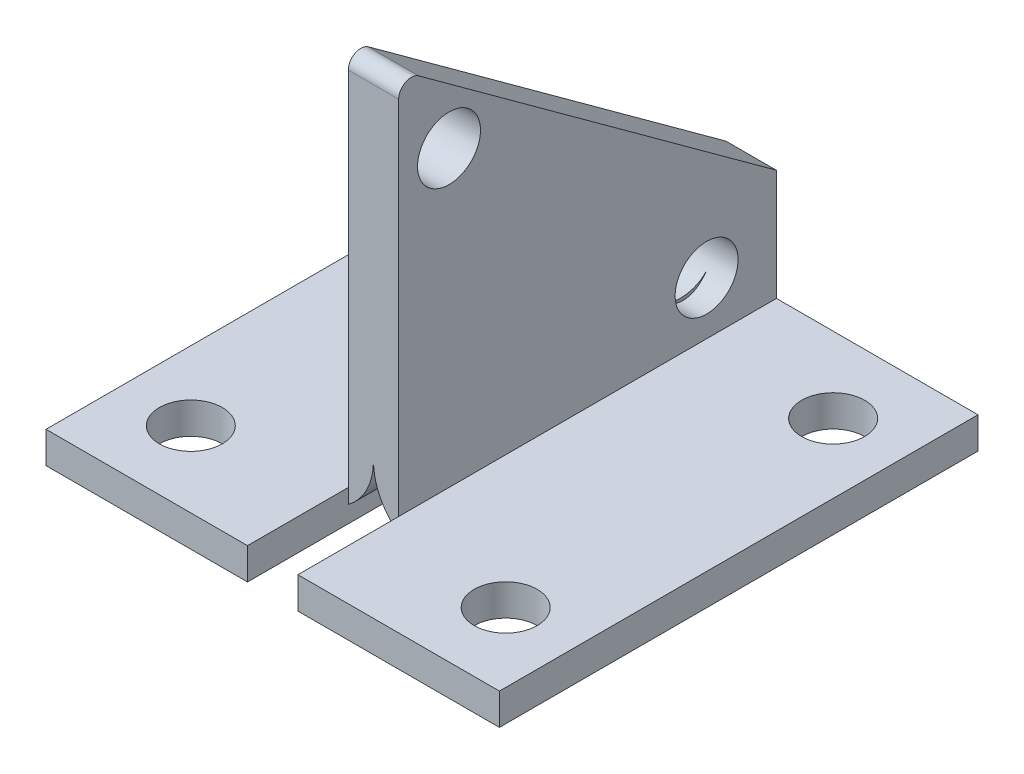
ISO-10303-21;
HEADER;
FILE_DESCRIPTION(('STEP AP214'),'2;1');
FILE_NAME('part.step','',(''),(''),'','','');
FILE_SCHEMA(('AUTOMOTIVE_DESIGN { 1 0 10303 214 1 1 1 1 }'));
ENDSEC;
DATA;
#1=APPLICATION_CONTEXT('core data for automotive mechanical design processes');
#2=APPLICATION_PROTOCOL_DEFINITION('international standard','automotive_design',2000,#1);
#3=PRODUCT_CONTEXT('',#1,'mechanical');
#4=PRODUCT('Part','Part','',(#3));
#5=PRODUCT_RELATED_PRODUCT_CATEGORY('part','',(#4));
#6=PRODUCT_DEFINITION_FORMATION('','',#4);
#7=PRODUCT_DEFINITION_CONTEXT('part definition',#1,'design');
#8=PRODUCT_DEFINITION('design','',#6,#7);
#9=PRODUCT_DEFINITION_SHAPE('','',#8);
#10=(LENGTH_UNIT() NAMED_UNIT(*) SI_UNIT(.MILLI.,.METRE.));
#11=(NAMED_UNIT(*) PLANE_ANGLE_UNIT() SI_UNIT($,.RADIAN.));
#12=(NAMED_UNIT(*) SI_UNIT($,.STERADIAN.) SOLID_ANGLE_UNIT());
#13=UNCERTAINTY_MEASURE_WITH_UNIT(LENGTH_MEASURE(1.E-05),#10,'distance_accuracy_value','');
#14=(GEOMETRIC_REPRESENTATION_CONTEXT(3) GLOBAL_UNCERTAINTY_ASSIGNED_CONTEXT((#13)) GLOBAL_UNIT_ASSIGNED_CONTEXT((#10,
#11,#12)) REPRESENTATION_CONTEXT('',''));
#15=CARTESIAN_POINT('',(0.,0.,0.));
#16=DIRECTION('',(0.,0.,1.));
#17=DIRECTION('',(1.,0.,0.));
#18=AXIS2_PLACEMENT_3D('',#15,#16,#17);
#19=CARTESIAN_POINT('',(2.,0.,0.));
#20=DIRECTION('',(1.,0.,0.));
#21=DIRECTION('',(0.,0.,-1.));
#22=AXIS2_PLACEMENT_3D('',#19,#20,#21);
#23=PLANE('',#22);
#24=DIRECTION('',(0.,0.588747506472137,0.808317000701359));
#25=VECTOR('',#24,1.);
#26=CARTESIAN_POINT('',(2.,12.5558053302707,60.9514449315034));
#27=LINE('',#26,#25);
#28=CARTESIAN_POINT('',(2.,-9.28274427099266,30.9683524864291));
#29=VERTEX_POINT('',#28);
#30=CARTESIAN_POINT('',(2.,11.3986217846597,59.3626974250312));
#31=VERTEX_POINT('',#30);
#32=EDGE_CURVE('E385',#29,#31,#27,.T.);
#33=ORIENTED_EDGE('',*,*,#32,.T.);
#34=CARTESIAN_POINT('',(2.,10.5903047839583,59.9514449315034));
#35=DIRECTION('',(1.,0.,0.));
#36=DIRECTION('',(0.,0.,-1.));
#37=AXIS2_PLACEMENT_3D('',#34,#35,#36);
#38=CIRCLE('',#37,1.);
#39=CARTESIAN_POINT('',(2.,10.5903047839583,60.9514449315034));
#40=VERTEX_POINT('',#39);
#41=EDGE_CURVE('E11',#31,#40,#38,.T.);
#42=ORIENTED_EDGE('',*,*,#41,.T.);
#43=DIRECTION('',(0.,-1.,0.));
#44=VECTOR('',#43,1.);
#45=CARTESIAN_POINT('',(2.,-19.2827442709927,60.9514449315034));
#46=LINE('',#45,#44);
#47=CARTESIAN_POINT('',(2.,-18.1092918345207,60.9514449315034));
#48=VERTEX_POINT('',#47);
#49=EDGE_CURVE('E297',#40,#48,#46,.T.);
#50=ORIENTED_EDGE('',*,*,#49,.T.);
#51=DIRECTION('',(0.,0.,1.));
#52=VECTOR('',#51,1.);
#53=CARTESIAN_POINT('',(2.,-18.1092918345207,68.9514449315034));
#54=LINE('',#53,#52);
#55=CARTESIAN_POINT('',(2.,-18.1092918345207,30.9534289526556));
#56=VERTEX_POINT('',#55);
#57=EDGE_CURVE('E395',#56,#48,#54,.T.);
#58=ORIENTED_EDGE('',*,*,#57,.F.);
#59=DIRECTION('',(0.,0.999998570675997,0.00169075307593077));
#60=VECTOR('',#59,1.);
#61=CARTESIAN_POINT('',(2.,-19.2827442709927,30.9514449315034));
#62=LINE('',#61,#60);
#63=EDGE_CURVE('E304',#56,#29,#62,.T.);
#64=ORIENTED_EDGE('',*,*,#63,.T.);
#65=EDGE_LOOP('',(#33,#42,#50,#58,#64));
#66=FACE_BOUND('',#65,.T.);
#67=CARTESIAN_POINT('',(2.,-13.9127450646303,36.5012704341606));
#68=DIRECTION('',(1.,0.,0.));
#69=DIRECTION('',(0.,0.,1.));
#70=AXIS2_PLACEMENT_3D('',#67,#68,#69);
#71=CIRCLE('',#70,2.5);
#72=CARTESIAN_POINT('',(2.,-13.9127450646303,39.0012704341606));
#73=VERTEX_POINT('',#72);
#74=EDGE_CURVE('E375',#73,#73,#71,.T.);
#75=ORIENTED_EDGE('',*,*,#74,.F.);
#76=EDGE_LOOP('',(#75));
#77=FACE_BOUND('',#76,.T.);
#78=CARTESIAN_POINT('',(2.,5.21290167027072,56.9514449315034));
#79=DIRECTION('',(1.,0.,0.));
#80=DIRECTION('',(0.,0.,1.));
#81=AXIS2_PLACEMENT_3D('',#78,#79,#80);
#82=CIRCLE('',#81,2.5);
#83=CARTESIAN_POINT('',(2.,5.21290167027072,59.4514449315034));
#84=VERTEX_POINT('',#83);
#85=EDGE_CURVE('E372',#84,#84,#82,.T.);
#86=ORIENTED_EDGE('',*,*,#85,.F.);
#87=EDGE_LOOP('',(#86));
#88=FACE_BOUND('',#87,.T.);
#89=ADVANCED_FACE('F33',(#66,#77,#88),#23,.T.);
#90=CARTESIAN_POINT('',(2.,-19.2827442709927,30.9514449315034));
#91=DIRECTION('',(0.,-0.00169075307593077,0.999998570675997));
#92=DIRECTION('',(0.,-0.999998570675997,-0.00169075307593077));
#93=AXIS2_PLACEMENT_3D('',#90,#91,#92);
#94=PLANE('',#93);
#95=DIRECTION('',(-1.,0.,0.));
#96=VECTOR('',#95,1.);
#97=CARTESIAN_POINT('',(18.,-19.2827442709927,30.9514449315034));
#98=LINE('',#97,#96);
#99=CARTESIAN_POINT('',(18.,-19.2827442709927,30.9514449315034));
#100=VERTEX_POINT('',#99);
#101=CARTESIAN_POINT('',(2.,-19.2827442709927,30.9514449315034));
#102=VERTEX_POINT('',#101);
#103=EDGE_CURVE('E405',#100,#102,#98,.T.);
#104=ORIENTED_EDGE('',*,*,#103,.T.);
#105=CARTESIAN_POINT('',(5.,-15.2827442709927,30.9582079534737));
#106=DIRECTION('',(0.,-0.00169075307593077,0.999998570675997));
#107=DIRECTION('',(0.,0.999998570675997,0.00169075307593077));
#108=AXIS2_PLACEMENT_3D('',#105,#106,#107);
#109=ELLIPSE('',#108,5.00000714663023,5.);
#110=CARTESIAN_POINT('',(0.,-15.2827442709927,30.9582079534737));
#111=VERTEX_POINT('',#110);
#112=EDGE_CURVE('E306',#102,#111,#109,.F.);
#113=ORIENTED_EDGE('',*,*,#112,.T.);
#114=CARTESIAN_POINT('',(-5.,-15.2827442709927,30.9582079534737));
#115=DIRECTION('',(0.,0.00169075307593077,-0.999998570675997));
#116=DIRECTION('',(0.,0.999998570675997,0.00169075307593077));
#117=AXIS2_PLACEMENT_3D('',#114,#115,#116);
#118=ELLIPSE('',#117,5.00000714663023,5.);
#119=CARTESIAN_POINT('',(-2.,-19.2827442709927,30.9514449315034));
#120=VERTEX_POINT('',#119);
#121=EDGE_CURVE('E225',#120,#111,#118,.F.);
#122=ORIENTED_EDGE('',*,*,#121,.F.);
#123=DIRECTION('',(1.,0.,0.));
#124=VECTOR('',#123,1.);
#125=CARTESIAN_POINT('',(-18.,-19.2827442709927,30.9514449315034));
#126=LINE('',#125,#124);
#127=CARTESIAN_POINT('',(-18.,-19.2827442709927,30.9514449315034));
#128=VERTEX_POINT('',#127);
#129=EDGE_CURVE('E180',#128,#120,#126,.T.);
#130=ORIENTED_EDGE('',*,*,#129,.F.);
#131=DIRECTION('',(0.,0.999998570675997,0.00169075307593095));
#132=VECTOR('',#131,1.);
#133=CARTESIAN_POINT('',(-18.,-18.1092918345207,30.9534289526556));
#134=LINE('',#133,#132);
#135=CARTESIAN_POINT('',(-18.,-18.1092918345207,30.9534289526556));
#136=VERTEX_POINT('',#135);
#137=EDGE_CURVE('E156',#128,#136,#134,.T.);
#138=ORIENTED_EDGE('',*,*,#137,.T.);
#139=DIRECTION('',(1.,0.,0.));
#140=VECTOR('',#139,1.);
#141=CARTESIAN_POINT('',(-18.,-18.1092918345207,30.9534289526556));
#142=LINE('',#141,#140);
#143=CARTESIAN_POINT('',(-2.,-18.1092918345207,30.9534289526556));
#144=VERTEX_POINT('',#143);
#145=EDGE_CURVE('E165',#136,#144,#142,.T.);
#146=ORIENTED_EDGE('',*,*,#145,.T.);
#147=DIRECTION('',(0.,0.999998570675997,0.00169075307593077));
#148=VECTOR('',#147,1.);
#149=CARTESIAN_POINT('',(-2.,-19.2827442709927,30.9514449315034));
#150=LINE('',#149,#148);
#151=CARTESIAN_POINT('',(-2.,-9.28274427099266,30.9683524864291));
#152=VERTEX_POINT('',#151);
#153=EDGE_CURVE('E216',#144,#152,#150,.T.);
#154=ORIENTED_EDGE('',*,*,#153,.T.);
#155=DIRECTION('',(-1.,0.,0.));
#156=VECTOR('',#155,1.);
#157=CARTESIAN_POINT('',(2.,-9.28274427099266,30.9683524864291));
#158=LINE('',#157,#156);
#159=EDGE_CURVE('E302',#29,#152,#158,.T.);
#160=ORIENTED_EDGE('',*,*,#159,.F.);
#161=ORIENTED_EDGE('',*,*,#63,.F.);
#162=DIRECTION('',(-1.,0.,0.));
#163=VECTOR('',#162,1.);
#164=CARTESIAN_POINT('',(18.,-18.1092918345207,30.9534289526556));
#165=LINE('',#164,#163);
#166=CARTESIAN_POINT('',(18.,-18.1092918345207,30.9534289526556));
#167=VERTEX_POINT('',#166);
#168=EDGE_CURVE('E369',#167,#56,#165,.T.);
#169=ORIENTED_EDGE('',*,*,#168,.F.);
#170=DIRECTION('',(0.,0.999998570675997,0.00169075307593095));
#171=VECTOR('',#170,1.);
#172=CARTESIAN_POINT('',(18.,-18.1092918345207,30.9534289526556));
#173=LINE('',#172,#171);
#174=EDGE_CURVE('E362',#100,#167,#173,.T.);
#175=ORIENTED_EDGE('',*,*,#174,.F.);
#176=EDGE_LOOP('',(#104,#113,#122,#130,#138,#146,#154,#160,#161,#169,#175));
#177=FACE_BOUND('',#176,.T.);
#178=ADVANCED_FACE('F177',(#177),#94,.F.);
#179=CARTESIAN_POINT('',(2.,12.5558053302707,60.9514449315034));
#180=DIRECTION('',(0.,-0.808317000701359,0.588747506472137));
#181=DIRECTION('',(0.,-0.588747506472137,-0.808317000701359));
#182=AXIS2_PLACEMENT_3D('',#179,#180,#181);
#183=PLANE('',#182);
#184=DIRECTION('',(0.,0.588747506472137,0.808317000701359));
#185=VECTOR('',#184,1.);
#186=CARTESIAN_POINT('',(-2.,12.5558053302707,60.9514449315034));
#187=LINE('',#186,#185);
#188=CARTESIAN_POINT('',(-2.,11.3986217846597,59.3626974250312));
#189=VERTEX_POINT('',#188);
#190=EDGE_CURVE('E218',#152,#189,#187,.T.);
#191=ORIENTED_EDGE('',*,*,#190,.T.);
#192=DIRECTION('',(-1.,0.,0.));
#193=VECTOR('',#192,1.);
#194=CARTESIAN_POINT('',(2.,11.3986217846597,59.3626974250312));
#195=LINE('',#194,#193);
#196=EDGE_CURVE('E41',#189,#31,#195,.F.);
#197=ORIENTED_EDGE('',*,*,#196,.T.);
#198=ORIENTED_EDGE('',*,*,#32,.F.);
#199=ORIENTED_EDGE('',*,*,#159,.T.);
#200=EDGE_LOOP('',(#191,#197,#198,#199));
#201=FACE_BOUND('',#200,.T.);
#202=ADVANCED_FACE('F264',(#201),#183,.F.);
#203=CARTESIAN_POINT('',(2.,-19.2827442709927,60.9514449315034));
#204=DIRECTION('',(0.,0.,-1.));
#205=DIRECTION('',(-1.,0.,0.));
#206=AXIS2_PLACEMENT_3D('',#203,#204,#205);
#207=PLANE('',#206);
#208=ORIENTED_EDGE('',*,*,#49,.F.);
#209=DIRECTION('',(-1.,0.,0.));
#210=VECTOR('',#209,1.);
#211=CARTESIAN_POINT('',(2.,10.5903047839583,60.9514449315034));
#212=LINE('',#211,#210);
#213=CARTESIAN_POINT('',(-2.,10.5903047839583,60.9514449315034));
#214=VERTEX_POINT('',#213);
#215=EDGE_CURVE('E290',#40,#214,#212,.T.);
#216=ORIENTED_EDGE('',*,*,#215,.T.);
#217=DIRECTION('',(0.,-1.,0.));
#218=VECTOR('',#217,1.);
#219=CARTESIAN_POINT('',(-2.,-19.2827442709927,60.9514449315034));
#220=LINE('',#219,#218);
#221=CARTESIAN_POINT('',(-2.,-18.1092918345207,60.9514449315034));
#222=VERTEX_POINT('',#221);
#223=EDGE_CURVE('E221',#214,#222,#220,.T.);
#224=ORIENTED_EDGE('',*,*,#223,.T.);
#225=CARTESIAN_POINT('',(-2.,-19.2827442709927,60.9514449315034));
#226=VERTEX_POINT('',#225);
#227=EDGE_CURVE('E220',#222,#226,#220,.T.);
#228=ORIENTED_EDGE('',*,*,#227,.T.);
#229=CARTESIAN_POINT('',(-5.,-15.2827442709927,60.9514449315034));
#230=DIRECTION('',(0.,0.,1.));
#231=DIRECTION('',(1.,0.,0.));
#232=AXIS2_PLACEMENT_3D('',#229,#230,#231);
#233=CIRCLE('',#232,5.);
#234=CARTESIAN_POINT('',(0.,-15.2827442709927,60.9514449315034));
#235=VERTEX_POINT('',#234);
#236=EDGE_CURVE('E237',#235,#226,#233,.F.);
#237=ORIENTED_EDGE('',*,*,#236,.F.);
#238=CARTESIAN_POINT('',(5.,-15.2827442709927,60.9514449315034));
#239=DIRECTION('',(0.,0.,-1.));
#240=DIRECTION('',(-1.,0.,0.));
#241=AXIS2_PLACEMENT_3D('',#238,#239,#240);
#242=CIRCLE('',#241,5.);
#243=CARTESIAN_POINT('',(2.,-19.2827442709927,60.9514449315034));
#244=VERTEX_POINT('',#243);
#245=EDGE_CURVE('E286',#235,#244,#242,.F.);
#246=ORIENTED_EDGE('',*,*,#245,.T.);
#247=EDGE_CURVE('E386',#48,#244,#46,.T.);
#248=ORIENTED_EDGE('',*,*,#247,.F.);
#249=EDGE_LOOP('',(#208,#216,#224,#228,#237,#246,#248));
#250=FACE_BOUND('',#249,.T.);
#251=ADVANCED_FACE('F272',(#250),#207,.F.);
#252=CARTESIAN_POINT('',(2.,-13.9127450646303,36.5012704341606));
#253=DIRECTION('',(-1.,0.,0.));
#254=DIRECTION('',(0.,0.,1.));
#255=AXIS2_PLACEMENT_3D('',#252,#253,#254);
#256=CYLINDRICAL_SURFACE('',#255,2.5);
#257=ORIENTED_EDGE('',*,*,#74,.T.);
#258=EDGE_LOOP('',(#257));
#259=FACE_BOUND('',#258,.T.);
#260=CARTESIAN_POINT('',(0.,-15.2827442709927,34.4100740840857));
#261=CARTESIAN_POINT('',(-4.28511707594996E-06,-15.3410090497743,34.4482353353031));
#262=CARTESIAN_POINT('',(0.00101837879846624,-15.3976584228549,34.4888368669929));
#263=CARTESIAN_POINT('',(0.00474607362536815,-15.5073236120352,34.5745759745494));
#264=CARTESIAN_POINT('',(0.00745049185515401,-15.560340743595,34.6197118934702));
#265=CARTESIAN_POINT('',(0.0141660489348207,-15.6623110467066,34.7141381109704));
#266=CARTESIAN_POINT('',(0.0181753733277464,-15.7112697435384,34.7634225709076));
#267=CARTESIAN_POINT('',(0.0271146518026331,-15.8048761063305,34.8658320135573));
#268=CARTESIAN_POINT('',(0.0320446750630159,-15.8495234479665,34.9189572846724));
#269=CARTESIAN_POINT('',(0.047627711227735,-15.9764875140652,35.0834870805119));
#270=CARTESIAN_POINT('',(0.0590869274821728,-16.0519916345904,35.2001991188087));
#271=CARTESIAN_POINT('',(0.0812010196539897,-16.1826518549157,35.4445108289209));
#272=CARTESIAN_POINT('',(0.0918558317004901,-16.2378063402735,35.5721113635888));
#273=CARTESIAN_POINT('',(0.110053837226963,-16.3270388455832,35.8371566265308));
#274=CARTESIAN_POINT('',(0.117541415860017,-16.3607450172546,35.9747312543802));
#275=CARTESIAN_POINT('',(0.127397713519472,-16.4044679180597,36.2537691757145));
#276=CARTESIAN_POINT('',(0.129767103359965,-16.4144877516533,36.3952319571379));
#277=CARTESIAN_POINT('',(0.128855731399794,-16.4105519138648,36.674503365805));
#278=CARTESIAN_POINT('',(0.125704989657259,-16.3971479800945,36.8123205170308));
#279=CARTESIAN_POINT('',(0.114701786544022,-16.347868064555,37.0836769919075));
#280=CARTESIAN_POINT('',(0.106848989366696,-16.3119904777769,37.2172160093094));
#281=CARTESIAN_POINT('',(0.0881791283546313,-16.2188291736433,37.4764410867338));
#282=CARTESIAN_POINT('',(0.0773606017351111,-16.1615348878601,37.6021232338527));
#283=CARTESIAN_POINT('',(0.0552513396637031,-16.0271150459358,37.8423096300565));
#284=CARTESIAN_POINT('',(0.0439606615430198,-15.9499918917027,37.9568152306614));
#285=CARTESIAN_POINT('',(0.0242933549679694,-15.7818763201875,38.1666637966052));
#286=CARTESIAN_POINT('',(0.0158040006775123,-15.6917142078932,38.262657657006));
#287=CARTESIAN_POINT('',(0.00669234295078711,-15.5459153419332,38.3952322167979));
#288=CARTESIAN_POINT('',(0.00425832712491138,-15.4955089634896,38.4375522182424));
#289=CARTESIAN_POINT('',(0.000910806598176895,-15.3914697960318,38.5181250462178));
#290=CARTESIAN_POINT('',(-2.16367603385721E-06,-15.3378358798618,38.5563764388063));
#291=CARTESIAN_POINT('',(0.,-15.2827442709927,38.5924667842355));
#292=B_SPLINE_CURVE_WITH_KNOTS('',3,(#260,#261,#262,#263,#264,#265,#266,#267,#268,#269,#270,
#271,#272,#273,#274,#275,#276,#277,#278,#279,#280,#281,#282,#283,#284,#285,#286,#287,#288,#289,
#290,#291),.UNSPECIFIED.,.F.,.F.,(4,2,2,2,2,2,2,2,2,2,2,2,2,2,2,4),(0.,0.208858758460938,
0.417641471922276,0.626135106920026,0.834644413782167,1.25099331579562,1.66737524183218,
2.09079226803067,2.51415379581801,2.92767714787023,3.34123003603657,3.75498726876529,
4.16869440589825,4.56279915569496,4.76018827722558,4.95764673775569),.UNSPECIFIED.);
#293=CARTESIAN_POINT('',(0.,-15.2827442709927,34.4100740840857));
#294=VERTEX_POINT('',#293);
#295=CARTESIAN_POINT('',(0.,-15.2827442709927,38.5924667842355));
#296=VERTEX_POINT('',#295);
#297=EDGE_CURVE('E279',#294,#296,#292,.T.);
#298=ORIENTED_EDGE('',*,*,#297,.T.);
#299=CARTESIAN_POINT('',(0.,-15.2827442709927,34.4100740840857));
#300=CARTESIAN_POINT('',(4.28511707594996E-06,-15.3410090497743,34.4482353353031));
#301=CARTESIAN_POINT('',(-0.00101837879846624,-15.3976584228549,34.4888368669929));
#302=CARTESIAN_POINT('',(-0.00474607362536815,-15.5073236120352,34.5745759745494));
#303=CARTESIAN_POINT('',(-0.00745049185515401,-15.560340743595,34.6197118934702));
#304=CARTESIAN_POINT('',(-0.0141660489348207,-15.6623110467066,34.7141381109704));
#305=CARTESIAN_POINT('',(-0.0181753733277464,-15.7112697435384,34.7634225709076));
#306=CARTESIAN_POINT('',(-0.0271146518026331,-15.8048761063305,34.8658320135573));
#307=CARTESIAN_POINT('',(-0.0320446750630159,-15.8495234479665,34.9189572846724));
#308=CARTESIAN_POINT('',(-0.047627711227735,-15.9764875140652,35.0834870805119));
#309=CARTESIAN_POINT('',(-0.0590869274821728,-16.0519916345904,35.2001991188087));
#310=CARTESIAN_POINT('',(-0.0812010196539897,-16.1826518549157,35.4445108289209));
#311=CARTESIAN_POINT('',(-0.0918558317004901,-16.2378063402735,35.5721113635888));
#312=CARTESIAN_POINT('',(-0.110053837226963,-16.3270388455832,35.8371566265308));
#313=CARTESIAN_POINT('',(-0.117541415860017,-16.3607450172546,35.9747312543802));
#314=CARTESIAN_POINT('',(-0.127397713519472,-16.4044679180597,36.2537691757145));
#315=CARTESIAN_POINT('',(-0.129767103359965,-16.4144877516533,36.3952319571379));
#316=CARTESIAN_POINT('',(-0.128855731399794,-16.4105519138648,36.674503365805));
#317=CARTESIAN_POINT('',(-0.125704989657259,-16.3971479800945,36.8123205170308));
#318=CARTESIAN_POINT('',(-0.114701786544022,-16.347868064555,37.0836769919075));
#319=CARTESIAN_POINT('',(-0.106848989366696,-16.3119904777769,37.2172160093094));
#320=CARTESIAN_POINT('',(-0.0881791283546313,-16.2188291736433,37.4764410867338));
#321=CARTESIAN_POINT('',(-0.0773606017351111,-16.1615348878601,37.6021232338527));
#322=CARTESIAN_POINT('',(-0.0552513396637031,-16.0271150459358,37.8423096300565));
#323=CARTESIAN_POINT('',(-0.0439606615430198,-15.9499918917027,37.9568152306614));
#324=CARTESIAN_POINT('',(-0.0242933549679694,-15.7818763201875,38.1666637966052));
#325=CARTESIAN_POINT('',(-0.0158040006775123,-15.6917142078932,38.262657657006));
#326=CARTESIAN_POINT('',(-0.00669234295078711,-15.5459153419332,38.3952322167979));
#327=CARTESIAN_POINT('',(-0.00425832712491138,-15.4955089634896,38.4375522182424));
#328=CARTESIAN_POINT('',(-0.000910806598176895,-15.3914697960318,38.5181250462178));
#329=CARTESIAN_POINT('',(2.16367603385721E-06,-15.3378358798618,38.5563764388063));
#330=CARTESIAN_POINT('',(0.,-15.2827442709927,38.5924667842355));
#331=B_SPLINE_CURVE_WITH_KNOTS('',3,(#299,#300,#301,#302,#303,#304,#305,#306,#307,#308,#309,
#310,#311,#312,#313,#314,#315,#316,#317,#318,#319,#320,#321,#322,#323,#324,#325,#326,#327,#328,
#329,#330),.UNSPECIFIED.,.F.,.F.,(4,2,2,2,2,2,2,2,2,2,2,2,2,2,2,4),(0.,0.208858758460938,
0.417641471922276,0.626135106920026,0.834644413782167,1.25099331579562,1.66737524183218,
2.09079226803067,2.51415379581801,2.92767714787023,3.34123003603657,3.75498726876529,
4.16869440589825,4.56279915569496,4.76018827722558,4.95764673775569),.UNSPECIFIED.);
#332=EDGE_CURVE('E228',#294,#296,#331,.T.);
#333=ORIENTED_EDGE('',*,*,#332,.F.);
#334=EDGE_LOOP('',(#298,#333));
#335=FACE_BOUND('',#334,.T.);
#336=CARTESIAN_POINT('',(-2.,-13.9127450646303,36.5012704341606));
#337=DIRECTION('',(1.,0.,0.));
#338=DIRECTION('',(0.,0.,1.));
#339=AXIS2_PLACEMENT_3D('',#336,#337,#338);
#340=CIRCLE('',#339,2.5);
#341=CARTESIAN_POINT('',(-2.,-13.9127450646303,39.0012704341606));
#342=VERTEX_POINT('',#341);
#343=EDGE_CURVE('E213',#342,#342,#340,.T.);
#344=ORIENTED_EDGE('',*,*,#343,.F.);
#345=EDGE_LOOP('',(#344));
#346=FACE_BOUND('',#345,.T.);
#347=ADVANCED_FACE('F269',(#259,#335,#346),#256,.F.);
#348=CARTESIAN_POINT('',(2.,5.21290167027072,56.9514449315034));
#349=DIRECTION('',(-1.,0.,0.));
#350=DIRECTION('',(0.,0.,1.));
#351=AXIS2_PLACEMENT_3D('',#348,#349,#350);
#352=CYLINDRICAL_SURFACE('',#351,2.5);
#353=ORIENTED_EDGE('',*,*,#85,.T.);
#354=EDGE_LOOP('',(#353));
#355=FACE_BOUND('',#354,.T.);
#356=CARTESIAN_POINT('',(-2.,5.21290167027072,56.9514449315034));
#357=DIRECTION('',(1.,0.,0.));
#358=DIRECTION('',(0.,0.,1.));
#359=AXIS2_PLACEMENT_3D('',#356,#357,#358);
#360=CIRCLE('',#359,2.5);
#361=CARTESIAN_POINT('',(-2.,5.21290167027072,59.4514449315034));
#362=VERTEX_POINT('',#361);
#363=EDGE_CURVE('E173',#362,#362,#360,.T.);
#364=ORIENTED_EDGE('',*,*,#363,.F.);
#365=EDGE_LOOP('',(#364));
#366=FACE_BOUND('',#365,.T.);
#367=ADVANCED_FACE('F325',(#355,#366),#352,.F.);
#368=CARTESIAN_POINT('',(18.,-18.1092918345207,68.9514449315034));
#369=DIRECTION('',(0.,-1.,0.));
#370=DIRECTION('',(0.,0.,-1.));
#371=AXIS2_PLACEMENT_3D('',#368,#369,#370);
#372=PLANE('',#371);
#373=CARTESIAN_POINT('',(12.5,-18.1092918345207,62.9534289526556));
#374=DIRECTION('',(0.,1.,0.));
#375=DIRECTION('',(0.,0.,1.));
#376=AXIS2_PLACEMENT_3D('',#373,#374,#375);
#377=CIRCLE('',#376,2.5);
#378=CARTESIAN_POINT('',(12.5,-18.1092918345207,65.4534289526556));
#379=VERTEX_POINT('',#378);
#380=EDGE_CURVE('E619',#379,#379,#377,.T.);
#381=ORIENTED_EDGE('',*,*,#380,.F.);
#382=EDGE_LOOP('',(#381));
#383=FACE_BOUND('',#382,.T.);
#384=CARTESIAN_POINT('',(12.5,-18.1092918345207,36.9534289526556));
#385=DIRECTION('',(0.,1.,0.));
#386=DIRECTION('',(0.,0.,1.));
#387=AXIS2_PLACEMENT_3D('',#384,#385,#386);
#388=CIRCLE('',#387,2.5);
#389=CARTESIAN_POINT('',(12.5,-18.1092918345207,39.4534289526556));
#390=VERTEX_POINT('',#389);
#391=EDGE_CURVE('E187',#390,#390,#388,.T.);
#392=ORIENTED_EDGE('',*,*,#391,.F.);
#393=EDGE_LOOP('',(#392));
#394=FACE_BOUND('',#393,.T.);
#395=ORIENTED_EDGE('',*,*,#57,.T.);
#396=CARTESIAN_POINT('',(2.,-18.1092918345207,68.9514449315034));
#397=VERTEX_POINT('',#396);
#398=EDGE_CURVE('E392',#48,#397,#54,.T.);
#399=ORIENTED_EDGE('',*,*,#398,.T.);
#400=DIRECTION('',(-1.,0.,0.));
#401=VECTOR('',#400,1.);
#402=CARTESIAN_POINT('',(18.,-18.1092918345207,68.9514449315034));
#403=LINE('',#402,#401);
#404=CARTESIAN_POINT('',(18.,-18.1092918345207,68.9514449315034));
#405=VERTEX_POINT('',#404);
#406=EDGE_CURVE('E373',#405,#397,#403,.T.);
#407=ORIENTED_EDGE('',*,*,#406,.F.);
#408=DIRECTION('',(0.,0.,1.));
#409=VECTOR('',#408,1.);
#410=CARTESIAN_POINT('',(18.,-18.1092918345207,68.9514449315034));
#411=LINE('',#410,#409);
#412=EDGE_CURVE('E363',#167,#405,#411,.T.);
#413=ORIENTED_EDGE('',*,*,#412,.F.);
#414=ORIENTED_EDGE('',*,*,#168,.T.);
#415=EDGE_LOOP('',(#395,#399,#407,#413,#414));
#416=FACE_BOUND('',#415,.T.);
#417=ADVANCED_FACE('F332',(#383,#394,#416),#372,.F.);
#418=CARTESIAN_POINT('',(18.,-20.6092918345207,68.9514449315034));
#419=DIRECTION('',(0.,0.,-1.));
#420=DIRECTION('',(-1.,0.,0.));
#421=AXIS2_PLACEMENT_3D('',#418,#419,#420);
#422=PLANE('',#421);
#423=DIRECTION('',(0.,-1.,0.));
#424=VECTOR('',#423,1.);
#425=CARTESIAN_POINT('',(2.,-20.6092918345207,68.9514449315034));
#426=LINE('',#425,#424);
#427=CARTESIAN_POINT('',(2.,-20.6092918345207,68.9514449315034));
#428=VERTEX_POINT('',#427);
#429=EDGE_CURVE('E397',#397,#428,#426,.T.);
#430=ORIENTED_EDGE('',*,*,#429,.T.);
#431=DIRECTION('',(-1.,0.,0.));
#432=VECTOR('',#431,1.);
#433=CARTESIAN_POINT('',(18.,-20.6092918345207,68.9514449315034));
#434=LINE('',#433,#432);
#435=CARTESIAN_POINT('',(18.,-20.6092918345207,68.9514449315034));
#436=VERTEX_POINT('',#435);
#437=EDGE_CURVE('E378',#436,#428,#434,.T.);
#438=ORIENTED_EDGE('',*,*,#437,.F.);
#439=DIRECTION('',(0.,-1.,0.));
#440=VECTOR('',#439,1.);
#441=CARTESIAN_POINT('',(18.,-19.6092918345207,68.9514449315034));
#442=LINE('',#441,#440);
#443=EDGE_CURVE('E649',#405,#436,#442,.T.);
#444=ORIENTED_EDGE('',*,*,#443,.F.);
#445=ORIENTED_EDGE('',*,*,#406,.T.);
#446=EDGE_LOOP('',(#430,#438,#444,#445));
#447=FACE_BOUND('',#446,.T.);
#448=ADVANCED_FACE('F337',(#447),#422,.F.);
#449=CARTESIAN_POINT('',(18.,-20.6092918345206,30.9514449315034));
#450=DIRECTION('',(0.,1.,0.));
#451=DIRECTION('',(0.,0.,1.));
#452=AXIS2_PLACEMENT_3D('',#449,#450,#451);
#453=PLANE('',#452);
#454=CARTESIAN_POINT('',(12.5,-20.6092918345207,62.9534289526556));
#455=DIRECTION('',(0.,1.,0.));
#456=DIRECTION('',(0.,0.,1.));
#457=AXIS2_PLACEMENT_3D('',#454,#455,#456);
#458=CIRCLE('',#457,2.5);
#459=CARTESIAN_POINT('',(12.5,-20.6092918345207,65.4534289526556));
#460=VERTEX_POINT('',#459);
#461=EDGE_CURVE('E426',#460,#460,#458,.T.);
#462=ORIENTED_EDGE('',*,*,#461,.T.);
#463=EDGE_LOOP('',(#462));
#464=FACE_BOUND('',#463,.T.);
#465=CARTESIAN_POINT('',(12.5,-20.6092918345207,36.9534289526556));
#466=DIRECTION('',(0.,1.,0.));
#467=DIRECTION('',(0.,0.,1.));
#468=AXIS2_PLACEMENT_3D('',#465,#466,#467);
#469=CIRCLE('',#468,2.5);
#470=CARTESIAN_POINT('',(12.5,-20.6092918345207,39.4534289526556));
#471=VERTEX_POINT('',#470);
#472=EDGE_CURVE('E621',#471,#471,#469,.T.);
#473=ORIENTED_EDGE('',*,*,#472,.T.);
#474=EDGE_LOOP('',(#473));
#475=FACE_BOUND('',#474,.T.);
#476=DIRECTION('',(0.,0.,-1.));
#477=VECTOR('',#476,1.);
#478=CARTESIAN_POINT('',(2.,-20.6092918345206,30.9514449315034));
#479=LINE('',#478,#477);
#480=CARTESIAN_POINT('',(2.,-20.6092918345206,30.9514449315034));
#481=VERTEX_POINT('',#480);
#482=EDGE_CURVE('E402',#428,#481,#479,.T.);
#483=ORIENTED_EDGE('',*,*,#482,.T.);
#484=DIRECTION('',(-1.,0.,0.));
#485=VECTOR('',#484,1.);
#486=CARTESIAN_POINT('',(18.,-20.6092918345206,30.9514449315034));
#487=LINE('',#486,#485);
#488=CARTESIAN_POINT('',(18.,-20.6092918345206,30.9514449315034));
#489=VERTEX_POINT('',#488);
#490=EDGE_CURVE('E407',#489,#481,#487,.T.);
#491=ORIENTED_EDGE('',*,*,#490,.F.);
#492=DIRECTION('',(0.,0.,-1.));
#493=VECTOR('',#492,1.);
#494=CARTESIAN_POINT('',(18.,-20.6092918345206,30.9514449315034));
#495=LINE('',#494,#493);
#496=EDGE_CURVE('E415',#436,#489,#495,.T.);
#497=ORIENTED_EDGE('',*,*,#496,.F.);
#498=ORIENTED_EDGE('',*,*,#437,.T.);
#499=EDGE_LOOP('',(#483,#491,#497,#498));
#500=FACE_BOUND('',#499,.T.);
#501=ADVANCED_FACE('F344',(#464,#475,#500),#453,.F.);
#502=CARTESIAN_POINT('',(18.,-19.2827442709927,30.9514449315034));
#503=DIRECTION('',(0.,0.,1.));
#504=DIRECTION('',(1.,0.,0.));
#505=AXIS2_PLACEMENT_3D('',#502,#503,#504);
#506=PLANE('',#505);
#507=DIRECTION('',(0.,1.,0.));
#508=VECTOR('',#507,1.);
#509=CARTESIAN_POINT('',(2.,-19.2827442709927,30.9514449315034));
#510=LINE('',#509,#508);
#511=EDGE_CURVE('E368',#481,#102,#510,.T.);
#512=ORIENTED_EDGE('',*,*,#511,.T.);
#513=ORIENTED_EDGE('',*,*,#103,.F.);
#514=DIRECTION('',(0.,1.,0.));
#515=VECTOR('',#514,1.);
#516=CARTESIAN_POINT('',(18.,-19.2827442709927,30.9514449315034));
#517=LINE('',#516,#515);
#518=EDGE_CURVE('E366',#489,#100,#517,.T.);
#519=ORIENTED_EDGE('',*,*,#518,.F.);
#520=ORIENTED_EDGE('',*,*,#490,.T.);
#521=EDGE_LOOP('',(#512,#513,#519,#520));
#522=FACE_BOUND('',#521,.T.);
#523=ADVANCED_FACE('F348',(#522),#506,.F.);
#524=CARTESIAN_POINT('',(18.,0.,0.));
#525=DIRECTION('',(-1.,0.,0.));
#526=DIRECTION('',(0.,0.,1.));
#527=AXIS2_PLACEMENT_3D('',#524,#525,#526);
#528=PLANE('',#527);
#529=ORIENTED_EDGE('',*,*,#174,.T.);
#530=ORIENTED_EDGE('',*,*,#412,.T.);
#531=ORIENTED_EDGE('',*,*,#443,.T.);
#532=ORIENTED_EDGE('',*,*,#496,.T.);
#533=ORIENTED_EDGE('',*,*,#518,.T.);
#534=EDGE_LOOP('',(#529,#530,#531,#532,#533));
#535=FACE_BOUND('',#534,.T.);
#536=ADVANCED_FACE('F352',(#535),#528,.F.);
#537=CARTESIAN_POINT('',(2.,0.,0.));
#538=DIRECTION('',(-1.,0.,0.));
#539=DIRECTION('',(0.,0.,1.));
#540=AXIS2_PLACEMENT_3D('',#537,#538,#539);
#541=PLANE('',#540);
#542=ORIENTED_EDGE('',*,*,#398,.F.);
#543=ORIENTED_EDGE('',*,*,#247,.T.);
#544=DIRECTION('',(0.,0.,-1.));
#545=VECTOR('',#544,1.);
#546=CARTESIAN_POINT('',(2.,-19.2827442709927,30.9514449315034));
#547=LINE('',#546,#545);
#548=EDGE_CURVE('E307',#244,#102,#547,.T.);
#549=ORIENTED_EDGE('',*,*,#548,.T.);
#550=ORIENTED_EDGE('',*,*,#511,.F.);
#551=ORIENTED_EDGE('',*,*,#482,.F.);
#552=ORIENTED_EDGE('',*,*,#429,.F.);
#553=EDGE_LOOP('',(#542,#543,#549,#550,#551,#552));
#554=FACE_BOUND('',#553,.T.);
#555=ADVANCED_FACE('F255',(#554),#541,.T.);
#556=CARTESIAN_POINT('',(5.,-15.2827442709927,30.9514449315034));
#557=DIRECTION('',(0.,0.,1.));
#558=DIRECTION('',(0.,-1.,0.));
#559=AXIS2_PLACEMENT_3D('',#556,#557,#558);
#560=CYLINDRICAL_SURFACE('',#559,5.);
#561=ORIENTED_EDGE('',*,*,#297,.F.);
#562=DIRECTION('',(0.,0.,1.));
#563=VECTOR('',#562,1.);
#564=CARTESIAN_POINT('',(0.,-15.2827442709926,0.));
#565=LINE('',#564,#563);
#566=EDGE_CURVE('E287',#111,#294,#565,.T.);
#567=ORIENTED_EDGE('',*,*,#566,.F.);
#568=ORIENTED_EDGE('',*,*,#112,.F.);
#569=ORIENTED_EDGE('',*,*,#548,.F.);
#570=ORIENTED_EDGE('',*,*,#245,.F.);
#571=DIRECTION('',(0.,0.,1.));
#572=VECTOR('',#571,1.);
#573=CARTESIAN_POINT('',(0.,-15.2827442709926,0.));
#574=LINE('',#573,#572);
#575=EDGE_CURVE('E309',#296,#235,#574,.T.);
#576=ORIENTED_EDGE('',*,*,#575,.F.);
#577=EDGE_LOOP('',(#561,#567,#568,#569,#570,#576));
#578=FACE_BOUND('',#577,.T.);
#579=ADVANCED_FACE('F248',(#578),#560,.T.);
#580=CARTESIAN_POINT('',(-2.,0.,0.));
#581=DIRECTION('',(-1.,0.,0.));
#582=DIRECTION('',(0.,0.,-1.));
#583=AXIS2_PLACEMENT_3D('',#580,#581,#582);
#584=PLANE('',#583);
#585=ORIENTED_EDGE('',*,*,#223,.F.);
#586=CARTESIAN_POINT('',(-2.,10.5903047839583,59.9514449315034));
#587=DIRECTION('',(-1.,0.,0.));
#588=DIRECTION('',(0.,0.,1.));
#589=AXIS2_PLACEMENT_3D('',#586,#587,#588);
#590=CIRCLE('',#589,1.);
#591=EDGE_CURVE('E55',#214,#189,#590,.T.);
#592=ORIENTED_EDGE('',*,*,#591,.T.);
#593=ORIENTED_EDGE('',*,*,#190,.F.);
#594=ORIENTED_EDGE('',*,*,#153,.F.);
#595=DIRECTION('',(0.,0.,1.));
#596=VECTOR('',#595,1.);
#597=CARTESIAN_POINT('',(-2.,-18.1092918345207,68.9514449315034));
#598=LINE('',#597,#596);
#599=EDGE_CURVE('E169',#144,#222,#598,.T.);
#600=ORIENTED_EDGE('',*,*,#599,.T.);
#601=EDGE_LOOP('',(#585,#592,#593,#594,#600));
#602=FACE_BOUND('',#601,.T.);
#603=ORIENTED_EDGE('',*,*,#343,.T.);
#604=EDGE_LOOP('',(#603));
#605=FACE_BOUND('',#604,.T.);
#606=ORIENTED_EDGE('',*,*,#363,.T.);
#607=EDGE_LOOP('',(#606));
#608=FACE_BOUND('',#607,.T.);
#609=ADVANCED_FACE('F246',(#602,#605,#608),#584,.T.);
#610=CARTESIAN_POINT('',(-18.,-18.1092918345207,68.9514449315034));
#611=DIRECTION('',(0.,-1.,0.));
#612=DIRECTION('',(0.,0.,-1.));
#613=AXIS2_PLACEMENT_3D('',#610,#611,#612);
#614=PLANE('',#613);
#615=CARTESIAN_POINT('',(-12.5,-18.1092918345207,62.9534289526556));
#616=DIRECTION('',(0.,-1.,0.));
#617=DIRECTION('',(0.,0.,1.));
#618=AXIS2_PLACEMENT_3D('',#615,#616,#617);
#619=CIRCLE('',#618,2.5);
#620=CARTESIAN_POINT('',(-12.5,-18.1092918345207,65.4534289526556));
#621=VERTEX_POINT('',#620);
#622=EDGE_CURVE('E613',#621,#621,#619,.T.);
#623=ORIENTED_EDGE('',*,*,#622,.T.);
#624=EDGE_LOOP('',(#623));
#625=FACE_BOUND('',#624,.T.);
#626=CARTESIAN_POINT('',(-12.5,-18.1092918345207,36.9534289526556));
#627=DIRECTION('',(0.,-1.,0.));
#628=DIRECTION('',(0.,0.,1.));
#629=AXIS2_PLACEMENT_3D('',#626,#627,#628);
#630=CIRCLE('',#629,2.5);
#631=CARTESIAN_POINT('',(-12.5,-18.1092918345207,39.4534289526556));
#632=VERTEX_POINT('',#631);
#633=EDGE_CURVE('E610',#632,#632,#630,.T.);
#634=ORIENTED_EDGE('',*,*,#633,.T.);
#635=EDGE_LOOP('',(#634));
#636=FACE_BOUND('',#635,.T.);
#637=ORIENTED_EDGE('',*,*,#599,.F.);
#638=ORIENTED_EDGE('',*,*,#145,.F.);
#639=DIRECTION('',(0.,0.,1.));
#640=VECTOR('',#639,1.);
#641=CARTESIAN_POINT('',(-18.,-18.1092918345207,68.9514449315034));
#642=LINE('',#641,#640);
#643=CARTESIAN_POINT('',(-18.,-18.1092918345207,68.9514449315034));
#644=VERTEX_POINT('',#643);
#645=EDGE_CURVE('E152',#136,#644,#642,.T.);
#646=ORIENTED_EDGE('',*,*,#645,.T.);
#647=DIRECTION('',(1.,0.,0.));
#648=VECTOR('',#647,1.);
#649=CARTESIAN_POINT('',(-18.,-18.1092918345207,68.9514449315034));
#650=LINE('',#649,#648);
#651=CARTESIAN_POINT('',(-2.,-18.1092918345207,68.9514449315034));
#652=VERTEX_POINT('',#651);
#653=EDGE_CURVE('E174',#644,#652,#650,.T.);
#654=ORIENTED_EDGE('',*,*,#653,.T.);
#655=EDGE_CURVE('E198',#222,#652,#598,.T.);
#656=ORIENTED_EDGE('',*,*,#655,.F.);
#657=EDGE_LOOP('',(#637,#638,#646,#654,#656));
#658=FACE_BOUND('',#657,.T.);
#659=ADVANCED_FACE('F166',(#625,#636,#658),#614,.F.);
#660=CARTESIAN_POINT('',(-18.,-20.6092918345207,68.9514449315034));
#661=DIRECTION('',(0.,0.,-1.));
#662=DIRECTION('',(1.,0.,0.));
#663=AXIS2_PLACEMENT_3D('',#660,#661,#662);
#664=PLANE('',#663);
#665=DIRECTION('',(0.,-1.,0.));
#666=VECTOR('',#665,1.);
#667=CARTESIAN_POINT('',(-2.,-20.6092918345207,68.9514449315034));
#668=LINE('',#667,#666);
#669=CARTESIAN_POINT('',(-2.,-20.6092918345207,68.9514449315034));
#670=VERTEX_POINT('',#669);
#671=EDGE_CURVE('E197',#652,#670,#668,.T.);
#672=ORIENTED_EDGE('',*,*,#671,.F.);
#673=ORIENTED_EDGE('',*,*,#653,.F.);
#674=DIRECTION('',(0.,-1.,0.));
#675=VECTOR('',#674,1.);
#676=CARTESIAN_POINT('',(-18.,-19.6092918345207,68.9514449315034));
#677=LINE('',#676,#675);
#678=CARTESIAN_POINT('',(-18.,-20.6092918345207,68.9514449315034));
#679=VERTEX_POINT('',#678);
#680=EDGE_CURVE('E159',#644,#679,#677,.T.);
#681=ORIENTED_EDGE('',*,*,#680,.T.);
#682=DIRECTION('',(1.,0.,0.));
#683=VECTOR('',#682,1.);
#684=CARTESIAN_POINT('',(-18.,-20.6092918345207,68.9514449315034));
#685=LINE('',#684,#683);
#686=EDGE_CURVE('E207',#679,#670,#685,.T.);
#687=ORIENTED_EDGE('',*,*,#686,.T.);
#688=EDGE_LOOP('',(#672,#673,#681,#687));
#689=FACE_BOUND('',#688,.T.);
#690=ADVANCED_FACE('F253',(#689),#664,.F.);
#691=CARTESIAN_POINT('',(-18.,-20.6092918345206,30.9514449315034));
#692=DIRECTION('',(0.,1.,0.));
#693=DIRECTION('',(0.,0.,1.));
#694=AXIS2_PLACEMENT_3D('',#691,#692,#693);
#695=PLANE('',#694);
#696=CARTESIAN_POINT('',(-12.5,-20.6092918345207,62.9534289526556));
#697=DIRECTION('',(0.,-1.,0.));
#698=DIRECTION('',(0.,0.,1.));
#699=AXIS2_PLACEMENT_3D('',#696,#697,#698);
#700=CIRCLE('',#699,2.5);
#701=CARTESIAN_POINT('',(-12.5,-20.6092918345207,65.4534289526556));
#702=VERTEX_POINT('',#701);
#703=EDGE_CURVE('E626',#702,#702,#700,.T.);
#704=ORIENTED_EDGE('',*,*,#703,.F.);
#705=EDGE_LOOP('',(#704));
#706=FACE_BOUND('',#705,.T.);
#707=CARTESIAN_POINT('',(-12.5,-20.6092918345207,36.9534289526556));
#708=DIRECTION('',(0.,-1.,0.));
#709=DIRECTION('',(0.,0.,1.));
#710=AXIS2_PLACEMENT_3D('',#707,#708,#709);
#711=CIRCLE('',#710,2.5);
#712=CARTESIAN_POINT('',(-12.5,-20.6092918345207,39.4534289526556));
#713=VERTEX_POINT('',#712);
#714=EDGE_CURVE('E607',#713,#713,#711,.T.);
#715=ORIENTED_EDGE('',*,*,#714,.F.);
#716=EDGE_LOOP('',(#715));
#717=FACE_BOUND('',#716,.T.);
#718=DIRECTION('',(0.,0.,-1.));
#719=VECTOR('',#718,1.);
#720=CARTESIAN_POINT('',(-2.,-20.6092918345206,30.9514449315034));
#721=LINE('',#720,#719);
#722=CARTESIAN_POINT('',(-2.,-20.6092918345206,30.9514449315034));
#723=VERTEX_POINT('',#722);
#724=EDGE_CURVE('E184',#670,#723,#721,.T.);
#725=ORIENTED_EDGE('',*,*,#724,.F.);
#726=ORIENTED_EDGE('',*,*,#686,.F.);
#727=DIRECTION('',(0.,0.,-1.));
#728=VECTOR('',#727,1.);
#729=CARTESIAN_POINT('',(-18.,-20.6092918345206,30.9514449315034));
#730=LINE('',#729,#728);
#731=CARTESIAN_POINT('',(-18.,-20.6092918345206,30.9514449315034));
#732=VERTEX_POINT('',#731);
#733=EDGE_CURVE('E191',#679,#732,#730,.T.);
#734=ORIENTED_EDGE('',*,*,#733,.T.);
#735=DIRECTION('',(1.,0.,0.));
#736=VECTOR('',#735,1.);
#737=CARTESIAN_POINT('',(-18.,-20.6092918345206,30.9514449315034));
#738=LINE('',#737,#736);
#739=EDGE_CURVE('E204',#732,#723,#738,.T.);
#740=ORIENTED_EDGE('',*,*,#739,.T.);
#741=EDGE_LOOP('',(#725,#726,#734,#740));
#742=FACE_BOUND('',#741,.T.);
#743=ADVANCED_FACE('F422',(#706,#717,#742),#695,.F.);
#744=CARTESIAN_POINT('',(-18.,-19.2827442709927,30.9514449315034));
#745=DIRECTION('',(0.,0.,1.));
#746=DIRECTION('',(-1.,0.,0.));
#747=AXIS2_PLACEMENT_3D('',#744,#745,#746);
#748=PLANE('',#747);
#749=DIRECTION('',(0.,1.,0.));
#750=VECTOR('',#749,1.);
#751=CARTESIAN_POINT('',(-2.,-19.2827442709927,30.9514449315034));
#752=LINE('',#751,#750);
#753=EDGE_CURVE('E181',#723,#120,#752,.T.);
#754=ORIENTED_EDGE('',*,*,#753,.F.);
#755=ORIENTED_EDGE('',*,*,#739,.F.);
#756=DIRECTION('',(0.,1.,0.));
#757=VECTOR('',#756,1.);
#758=CARTESIAN_POINT('',(-18.,-19.2827442709927,30.9514449315034));
#759=LINE('',#758,#757);
#760=EDGE_CURVE('E194',#732,#128,#759,.T.);
#761=ORIENTED_EDGE('',*,*,#760,.T.);
#762=ORIENTED_EDGE('',*,*,#129,.T.);
#763=EDGE_LOOP('',(#754,#755,#761,#762));
#764=FACE_BOUND('',#763,.T.);
#765=ADVANCED_FACE('F418',(#764),#748,.F.);
#766=CARTESIAN_POINT('',(-18.,0.,0.));
#767=DIRECTION('',(1.,0.,0.));
#768=DIRECTION('',(0.,0.,1.));
#769=AXIS2_PLACEMENT_3D('',#766,#767,#768);
#770=PLANE('',#769);
#771=ORIENTED_EDGE('',*,*,#137,.F.);
#772=ORIENTED_EDGE('',*,*,#760,.F.);
#773=ORIENTED_EDGE('',*,*,#733,.F.);
#774=ORIENTED_EDGE('',*,*,#680,.F.);
#775=ORIENTED_EDGE('',*,*,#645,.F.);
#776=EDGE_LOOP('',(#771,#772,#773,#774,#775));
#777=FACE_BOUND('',#776,.T.);
#778=ADVANCED_FACE('F154',(#777),#770,.F.);
#779=CARTESIAN_POINT('',(-2.,0.,0.));
#780=DIRECTION('',(1.,0.,0.));
#781=DIRECTION('',(0.,0.,1.));
#782=AXIS2_PLACEMENT_3D('',#779,#780,#781);
#783=PLANE('',#782);
#784=ORIENTED_EDGE('',*,*,#655,.T.);
#785=ORIENTED_EDGE('',*,*,#671,.T.);
#786=ORIENTED_EDGE('',*,*,#724,.T.);
#787=ORIENTED_EDGE('',*,*,#753,.T.);
#788=DIRECTION('',(0.,0.,-1.));
#789=VECTOR('',#788,1.);
#790=CARTESIAN_POINT('',(-2.,-19.2827442709927,30.9514449315034));
#791=LINE('',#790,#789);
#792=EDGE_CURVE('E223',#226,#120,#791,.T.);
#793=ORIENTED_EDGE('',*,*,#792,.F.);
#794=ORIENTED_EDGE('',*,*,#227,.F.);
#795=EDGE_LOOP('',(#784,#785,#786,#787,#793,#794));
#796=FACE_BOUND('',#795,.T.);
#797=ADVANCED_FACE('F427',(#796),#783,.T.);
#798=CARTESIAN_POINT('',(-5.,-15.2827442709927,30.9514449315034));
#799=DIRECTION('',(0.,0.,1.));
#800=DIRECTION('',(0.,-1.,0.));
#801=AXIS2_PLACEMENT_3D('',#798,#799,#800);
#802=CYLINDRICAL_SURFACE('',#801,5.);
#803=ORIENTED_EDGE('',*,*,#332,.T.);
#804=ORIENTED_EDGE('',*,*,#575,.T.);
#805=ORIENTED_EDGE('',*,*,#236,.T.);
#806=ORIENTED_EDGE('',*,*,#792,.T.);
#807=ORIENTED_EDGE('',*,*,#121,.T.);
#808=ORIENTED_EDGE('',*,*,#566,.T.);
#809=EDGE_LOOP('',(#803,#804,#805,#806,#807,#808));
#810=FACE_BOUND('',#809,.T.);
#811=ADVANCED_FACE('F239',(#810),#802,.T.);
#812=CARTESIAN_POINT('',(12.5,-20.6092918345207,36.9534289526556));
#813=DIRECTION('',(0.,1.,0.));
#814=DIRECTION('',(0.,0.,1.));
#815=AXIS2_PLACEMENT_3D('',#812,#813,#814);
#816=CYLINDRICAL_SURFACE('',#815,2.5);
#817=ORIENTED_EDGE('',*,*,#472,.F.);
#818=EDGE_LOOP('',(#817));
#819=FACE_BOUND('',#818,.T.);
#820=ORIENTED_EDGE('',*,*,#391,.T.);
#821=EDGE_LOOP('',(#820));
#822=FACE_BOUND('',#821,.T.);
#823=ADVANCED_FACE('F434',(#819,#822),#816,.F.);
#824=CARTESIAN_POINT('',(12.5,-20.6092918345207,62.9534289526556));
#825=DIRECTION('',(0.,1.,0.));
#826=DIRECTION('',(0.,0.,1.));
#827=AXIS2_PLACEMENT_3D('',#824,#825,#826);
#828=CYLINDRICAL_SURFACE('',#827,2.5);
#829=ORIENTED_EDGE('',*,*,#461,.F.);
#830=EDGE_LOOP('',(#829));
#831=FACE_BOUND('',#830,.T.);
#832=ORIENTED_EDGE('',*,*,#380,.T.);
#833=EDGE_LOOP('',(#832));
#834=FACE_BOUND('',#833,.T.);
#835=ADVANCED_FACE('F496',(#831,#834),#828,.F.);
#836=CARTESIAN_POINT('',(-12.5,-20.6092918345207,36.9534289526556));
#837=DIRECTION('',(0.,1.,0.));
#838=DIRECTION('',(0.,0.,1.));
#839=AXIS2_PLACEMENT_3D('',#836,#837,#838);
#840=CYLINDRICAL_SURFACE('',#839,2.5);
#841=ORIENTED_EDGE('',*,*,#714,.T.);
#842=EDGE_LOOP('',(#841));
#843=FACE_BOUND('',#842,.T.);
#844=ORIENTED_EDGE('',*,*,#633,.F.);
#845=EDGE_LOOP('',(#844));
#846=FACE_BOUND('',#845,.T.);
#847=ADVANCED_FACE('F504',(#843,#846),#840,.F.);
#848=CARTESIAN_POINT('',(-12.5,-20.6092918345207,62.9534289526556));
#849=DIRECTION('',(0.,1.,0.));
#850=DIRECTION('',(0.,0.,1.));
#851=AXIS2_PLACEMENT_3D('',#848,#849,#850);
#852=CYLINDRICAL_SURFACE('',#851,2.5);
#853=ORIENTED_EDGE('',*,*,#703,.T.);
#854=EDGE_LOOP('',(#853));
#855=FACE_BOUND('',#854,.T.);
#856=ORIENTED_EDGE('',*,*,#622,.F.);
#857=EDGE_LOOP('',(#856));
#858=FACE_BOUND('',#857,.T.);
#859=ADVANCED_FACE('F587',(#855,#858),#852,.F.);
#860=CARTESIAN_POINT('',(2.,10.5903047839583,59.9514449315034));
#861=DIRECTION('',(-1.,0.,0.));
#862=DIRECTION('',(0.,0.,1.));
#863=AXIS2_PLACEMENT_3D('',#860,#861,#862);
#864=CYLINDRICAL_SURFACE('',#863,1.);
#865=ORIENTED_EDGE('',*,*,#41,.F.);
#866=ORIENTED_EDGE('',*,*,#196,.F.);
#867=ORIENTED_EDGE('',*,*,#591,.F.);
#868=ORIENTED_EDGE('',*,*,#215,.F.);
#869=EDGE_LOOP('',(#865,#866,#867,#868));
#870=FACE_BOUND('',#869,.T.);
#871=ADVANCED_FACE('F35',(#870),#864,.T.);
#872=CLOSED_SHELL('',(#89,#178,#202,#251,#347,#367,#417,#448,#501,#523,#536,#555,#579,#609,#659,
#690,#743,#765,#778,#797,#811,#823,#835,#847,#859,#871));
#873=MANIFOLD_SOLID_BREP('B2',#872);
#874=ADVANCED_BREP_SHAPE_REPRESENTATION('',(#18,#873),#14);
#875=SHAPE_DEFINITION_REPRESENTATION(#9,#874);
ENDSEC;
END-ISO-10303-21;
